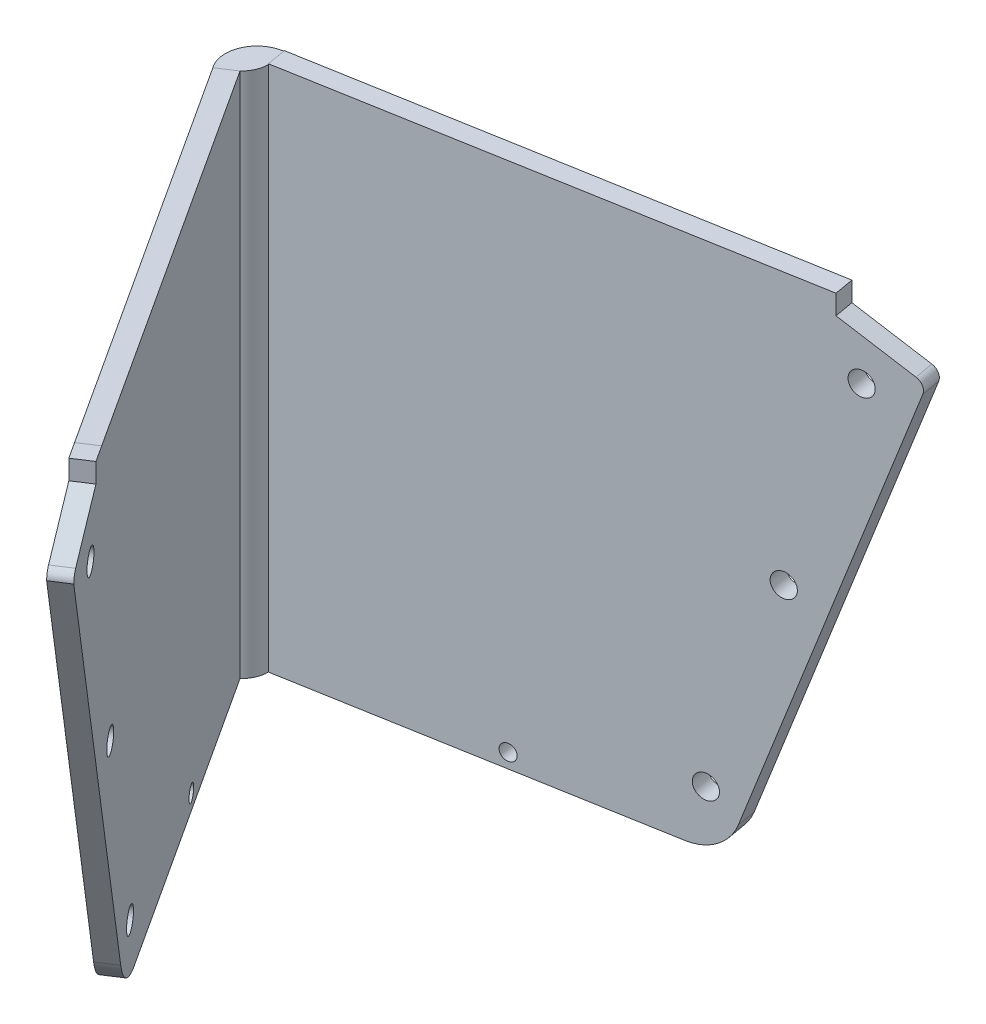
ISO-10303-21;
HEADER;
FILE_DESCRIPTION(('STEP AP214'),'2;1');
FILE_NAME('part.step','',(''),(''),'','','');
FILE_SCHEMA(('AUTOMOTIVE_DESIGN { 1 0 10303 214 1 1 1 1 }'));
ENDSEC;
DATA;
#1=APPLICATION_CONTEXT('core data for automotive mechanical design processes');
#2=APPLICATION_PROTOCOL_DEFINITION('international standard','automotive_design',2000,#1);
#3=PRODUCT_CONTEXT('',#1,'mechanical');
#4=PRODUCT('Part','Part','',(#3));
#5=PRODUCT_RELATED_PRODUCT_CATEGORY('part','',(#4));
#6=PRODUCT_DEFINITION_FORMATION('','',#4);
#7=PRODUCT_DEFINITION_CONTEXT('part definition',#1,'design');
#8=PRODUCT_DEFINITION('design','',#6,#7);
#9=PRODUCT_DEFINITION_SHAPE('','',#8);
#10=(LENGTH_UNIT() NAMED_UNIT(*) SI_UNIT(.MILLI.,.METRE.));
#11=(NAMED_UNIT(*) PLANE_ANGLE_UNIT() SI_UNIT($,.RADIAN.));
#12=(NAMED_UNIT(*) SI_UNIT($,.STERADIAN.) SOLID_ANGLE_UNIT());
#13=UNCERTAINTY_MEASURE_WITH_UNIT(LENGTH_MEASURE(1.E-05),#10,'distance_accuracy_value','');
#14=(GEOMETRIC_REPRESENTATION_CONTEXT(3) GLOBAL_UNCERTAINTY_ASSIGNED_CONTEXT((#13)) GLOBAL_UNIT_ASSIGNED_CONTEXT((#10,
#11,#12)) REPRESENTATION_CONTEXT('',''));
#15=CARTESIAN_POINT('',(0.,0.,0.));
#16=DIRECTION('',(0.,0.,1.));
#17=DIRECTION('',(1.,0.,0.));
#18=AXIS2_PLACEMENT_3D('',#15,#16,#17);
#19=CARTESIAN_POINT('',(-87.7890705863811,13.2918197172623,33.7086379474731));
#20=DIRECTION('',(0.,1.,0.));
#21=DIRECTION('',(0.,0.,1.));
#22=AXIS2_PLACEMENT_3D('',#19,#20,#21);
#23=PLANE('',#22);
#24=DIRECTION('',(0.544639035015025,0.,0.838670567945425));
#25=VECTOR('',#24,1.);
#26=CARTESIAN_POINT('',(-88.4261592946522,13.2918197172623,34.1223681921648));
#27=LINE('',#26,#25);
#28=CARTESIAN_POINT('',(-87.6837386520631,13.2918197172623,35.2655957281004));
#29=VERTEX_POINT('',#28);
#30=CARTESIAN_POINT('',(-87.6599356576769,13.2918197172623,35.3022491251896));
#31=VERTEX_POINT('',#30);
#32=EDGE_CURVE('E68',#29,#31,#27,.T.);
#33=ORIENTED_EDGE('',*,*,#32,.F.);
#34=DIRECTION('',(0.838670567945425,0.,-0.544639035015025));
#35=VECTOR('',#34,1.);
#36=CARTESIAN_POINT('',(-87.683738652063,13.2918197172623,35.2655957281005));
#37=LINE('',#36,#35);
#38=CARTESIAN_POINT('',(-86.8450680841176,13.2918197172623,34.7209566930854));
#39=VERTEX_POINT('',#38);
#40=EDGE_CURVE('E188',#29,#39,#37,.T.);
#41=ORIENTED_EDGE('',*,*,#40,.T.);
#42=CARTESIAN_POINT('',(-87.7890705863811,13.2918197172623,33.7086379474731));
#43=DIRECTION('',(0.,-1.,0.));
#44=DIRECTION('',(0.,0.,1.));
#45=AXIS2_PLACEMENT_3D('',#42,#43,#44);
#46=CIRCLE('',#45,1.38417122026059);
#47=CARTESIAN_POINT('',(-86.4048993661205,13.2918197172623,33.7086379474731));
#48=VERTEX_POINT('',#47);
#49=EDGE_CURVE('E236',#48,#39,#46,.T.);
#50=ORIENTED_EDGE('',*,*,#49,.F.);
#51=DIRECTION('',(0.,0.,1.));
#52=VECTOR('',#51,1.);
#53=CARTESIAN_POINT('',(-86.4048993661205,13.2918197172623,33.7086379474731));
#54=LINE('',#53,#52);
#55=CARTESIAN_POINT('',(-86.4048993661205,13.2918197172623,32.7086379474731));
#56=VERTEX_POINT('',#55);
#57=EDGE_CURVE('E242',#56,#48,#54,.T.);
#58=ORIENTED_EDGE('',*,*,#57,.F.);
#59=CARTESIAN_POINT('',(-86.3764557247758,13.2918197172623,34.3228603703528));
#60=DIRECTION('',(0.,-1.,0.));
#61=DIRECTION('',(0.,0.,1.));
#62=AXIS2_PLACEMENT_3D('',#59,#60,#61);
#63=CIRCLE('',#62,1.61447300109373);
#64=EDGE_CURVE('E239',#31,#56,#63,.T.);
#65=ORIENTED_EDGE('',*,*,#64,.F.);
#66=EDGE_LOOP('',(#33,#41,#50,#58,#65));
#67=FACE_BOUND('',#66,.T.);
#68=ADVANCED_FACE('F51',(#67),#23,.T.);
#69=CARTESIAN_POINT('',(-87.7890705863811,13.2918197172623,33.7086379474731));
#70=DIRECTION('',(0.,-1.,0.));
#71=DIRECTION('',(0.,0.,-1.));
#72=AXIS2_PLACEMENT_3D('',#69,#70,#71);
#73=CYLINDRICAL_SURFACE('',#72,1.38417122026059);
#74=CARTESIAN_POINT('',(-87.7890705863811,-13.5581802827377,33.7086379474731));
#75=DIRECTION('',(0.,-1.,0.));
#76=DIRECTION('',(0.,0.,1.));
#77=AXIS2_PLACEMENT_3D('',#74,#75,#76);
#78=CIRCLE('',#77,1.38417122026059);
#79=CARTESIAN_POINT('',(-86.4048993661205,-13.5581802827377,33.7086379474731));
#80=VERTEX_POINT('',#79);
#81=CARTESIAN_POINT('',(-86.8450680841176,-13.5581802827377,34.7209566930854));
#82=VERTEX_POINT('',#81);
#83=EDGE_CURVE('E235',#80,#82,#78,.T.);
#84=ORIENTED_EDGE('',*,*,#83,.F.);
#85=DIRECTION('',(0.,-1.,0.));
#86=VECTOR('',#85,1.);
#87=CARTESIAN_POINT('',(-86.4048993661205,13.2918197172623,33.7086379474731));
#88=LINE('',#87,#86);
#89=EDGE_CURVE('E12',#48,#80,#88,.T.);
#90=ORIENTED_EDGE('',*,*,#89,.F.);
#91=ORIENTED_EDGE('',*,*,#49,.T.);
#92=DIRECTION('',(0.,-1.,0.));
#93=VECTOR('',#92,1.);
#94=CARTESIAN_POINT('',(-86.8450680841176,13.2918197172623,34.7209566930854));
#95=LINE('',#94,#93);
#96=EDGE_CURVE('E55',#39,#82,#95,.T.);
#97=ORIENTED_EDGE('',*,*,#96,.T.);
#98=EDGE_LOOP('',(#84,#90,#91,#97));
#99=FACE_BOUND('',#98,.T.);
#100=ADVANCED_FACE('F53',(#99),#73,.T.);
#101=CARTESIAN_POINT('',(-86.4048993661205,13.2918197172623,33.7086379474731));
#102=DIRECTION('',(1.,0.,0.));
#103=DIRECTION('',(0.,0.,-1.));
#104=AXIS2_PLACEMENT_3D('',#101,#102,#103);
#105=PLANE('',#104);
#106=DIRECTION('',(0.,0.,1.));
#107=VECTOR('',#106,1.);
#108=CARTESIAN_POINT('',(-86.4048993661205,-13.5581802827377,33.7086379474731));
#109=LINE('',#108,#107);
#110=CARTESIAN_POINT('',(-86.4048993661205,-13.5581802827377,32.7086379474731));
#111=VERTEX_POINT('',#110);
#112=EDGE_CURVE('E240',#111,#80,#109,.T.);
#113=ORIENTED_EDGE('',*,*,#112,.F.);
#114=DIRECTION('',(0.,-1.,0.));
#115=VECTOR('',#114,1.);
#116=CARTESIAN_POINT('',(-86.4048993661205,13.2918197172623,32.7086379474731));
#117=LINE('',#116,#115);
#118=EDGE_CURVE('E60',#56,#111,#117,.T.);
#119=ORIENTED_EDGE('',*,*,#118,.F.);
#120=ORIENTED_EDGE('',*,*,#57,.T.);
#121=ORIENTED_EDGE('',*,*,#89,.T.);
#122=EDGE_LOOP('',(#113,#119,#120,#121));
#123=FACE_BOUND('',#122,.T.);
#124=ADVANCED_FACE('F288',(#123),#105,.T.);
#125=CARTESIAN_POINT('',(-86.3764557247758,13.2918197172623,34.3228603703528));
#126=DIRECTION('',(0.,-1.,0.));
#127=DIRECTION('',(0.,0.,-1.));
#128=AXIS2_PLACEMENT_3D('',#125,#126,#127);
#129=CYLINDRICAL_SURFACE('',#128,1.61447300109373);
#130=DIRECTION('',(0.,-1.,0.));
#131=VECTOR('',#130,1.);
#132=CARTESIAN_POINT('',(-87.6599356576769,13.2918197172623,35.3022491251896));
#133=LINE('',#132,#131);
#134=CARTESIAN_POINT('',(-87.6599356576769,-13.5581802827377,35.3022491251896));
#135=VERTEX_POINT('',#134);
#136=EDGE_CURVE('E145',#31,#135,#133,.T.);
#137=ORIENTED_EDGE('',*,*,#136,.F.);
#138=ORIENTED_EDGE('',*,*,#64,.T.);
#139=ORIENTED_EDGE('',*,*,#118,.T.);
#140=CARTESIAN_POINT('',(-86.3764557247758,-13.5581802827377,34.3228603703528));
#141=DIRECTION('',(0.,-1.,0.));
#142=DIRECTION('',(0.,0.,1.));
#143=AXIS2_PLACEMENT_3D('',#140,#141,#142);
#144=CIRCLE('',#143,1.61447300109373);
#145=EDGE_CURVE('E76',#135,#111,#144,.T.);
#146=ORIENTED_EDGE('',*,*,#145,.F.);
#147=EDGE_LOOP('',(#137,#138,#139,#146));
#148=FACE_BOUND('',#147,.T.);
#149=ADVANCED_FACE('F290',(#148),#129,.T.);
#150=CARTESIAN_POINT('',(-87.7890705863811,-13.5581802827377,33.7086379474731));
#151=DIRECTION('',(0.,1.,0.));
#152=DIRECTION('',(0.,0.,1.));
#153=AXIS2_PLACEMENT_3D('',#150,#151,#152);
#154=PLANE('',#153);
#155=DIRECTION('',(0.544639035015025,0.,0.838670567945425));
#156=VECTOR('',#155,1.);
#157=CARTESIAN_POINT('',(-77.7823264761029,-13.5581802827378,50.5124334301487));
#158=LINE('',#157,#156);
#159=CARTESIAN_POINT('',(-77.6892577633896,-13.5581802827377,50.6557466800833));
#160=VERTEX_POINT('',#159);
#161=EDGE_CURVE('E138',#135,#160,#158,.T.);
#162=ORIENTED_EDGE('',*,*,#161,.F.);
#163=ORIENTED_EDGE('',*,*,#145,.T.);
#164=ORIENTED_EDGE('',*,*,#112,.T.);
#165=ORIENTED_EDGE('',*,*,#83,.T.);
#166=DIRECTION('',(0.544639035015025,0.,0.838670567945425));
#167=VECTOR('',#166,1.);
#168=CARTESIAN_POINT('',(-76.9436559081574,-13.5581802827378,49.9677943951337));
#169=LINE('',#168,#167);
#170=CARTESIAN_POINT('',(-76.8505871954441,-13.5581802827377,50.1111076450683));
#171=VERTEX_POINT('',#170);
#172=EDGE_CURVE('E154',#82,#171,#169,.T.);
#173=ORIENTED_EDGE('',*,*,#172,.T.);
#174=DIRECTION('',(0.838670567945425,0.,-0.544639035015025));
#175=VECTOR('',#174,1.);
#176=CARTESIAN_POINT('',(-77.6892577633896,-13.5581802827377,50.6557466800833));
#177=LINE('',#176,#175);
#178=EDGE_CURVE('E150',#160,#171,#177,.T.);
#179=ORIENTED_EDGE('',*,*,#178,.F.);
#180=EDGE_LOOP('',(#162,#163,#164,#165,#173,#179));
#181=FACE_BOUND('',#180,.T.);
#182=ADVANCED_FACE('F151',(#181),#154,.F.);
#183=CARTESIAN_POINT('',(-77.6892577633896,-11.0581802827377,50.6557466800833));
#184=DIRECTION('',(0.838670567945425,0.,-0.544639035015025));
#185=DIRECTION('',(-0.544639035015025,0.,-0.838670567945425));
#186=AXIS2_PLACEMENT_3D('',#183,#184,#185);
#187=CYLINDRICAL_SURFACE('',#186,2.5);
#188=CARTESIAN_POINT('',(-76.8505871954441,-11.0581802827377,50.1111076450683));
#189=DIRECTION('',(-0.838670567945425,0.,0.544639035015025));
#190=DIRECTION('',(0.544639035015025,0.,0.838670567945425));
#191=AXIS2_PLACEMENT_3D('',#188,#189,#190);
#192=CIRCLE('',#191,2.5);
#193=CARTESIAN_POINT('',(-75.5711039899552,-11.9132306410519,52.0813390049899));
#194=VERTEX_POINT('',#193);
#195=EDGE_CURVE('E190',#171,#194,#192,.T.);
#196=ORIENTED_EDGE('',*,*,#195,.T.);
#197=DIRECTION('',(0.838670567945425,0.,-0.544639035015025));
#198=VECTOR('',#197,1.);
#199=CARTESIAN_POINT('',(-76.4097745579006,-11.9132306410519,52.6259780400049));
#200=LINE('',#199,#198);
#201=CARTESIAN_POINT('',(-76.4097745579006,-11.9132306410519,52.6259780400049));
#202=VERTEX_POINT('',#201);
#203=EDGE_CURVE('E157',#202,#194,#200,.T.);
#204=ORIENTED_EDGE('',*,*,#203,.F.);
#205=CARTESIAN_POINT('',(-77.6892577633896,-11.0581802827377,50.6557466800833));
#206=DIRECTION('',(-0.838670567945425,0.,0.544639035015025));
#207=DIRECTION('',(0.544639035015025,0.,0.838670567945425));
#208=AXIS2_PLACEMENT_3D('',#205,#206,#207);
#209=CIRCLE('',#208,2.5);
#210=EDGE_CURVE('E143',#160,#202,#209,.T.);
#211=ORIENTED_EDGE('',*,*,#210,.F.);
#212=ORIENTED_EDGE('',*,*,#178,.T.);
#213=EDGE_LOOP('',(#196,#204,#211,#212));
#214=FACE_BOUND('',#213,.T.);
#215=ADVANCED_FACE('F159',(#214),#187,.T.);
#216=CARTESIAN_POINT('',(-74.490159444689,-2.19145722415175,55.5819260968484));
#217=DIRECTION('',(-0.512027693066062,0.340835314924312,-0.788453505055239));
#218=DIRECTION('',(-0.838670567945425,0.,0.544639035015025));
#219=AXIS2_PLACEMENT_3D('',#216,#217,#218);
#220=PLANE('',#219);
#221=DIRECTION('',(0.18563221701942,0.940123017535708,0.285848547143431));
#222=VECTOR('',#221,1.);
#223=CARTESIAN_POINT('',(-73.6514888767436,-2.19145722415175,55.0372870618334));
#224=LINE('',#223,#222);
#225=CARTESIAN_POINT('',(-71.1306866434094,10.5749916189658,58.9189821016503));
#226=VERTEX_POINT('',#225);
#227=EDGE_CURVE('E192',#194,#226,#224,.T.);
#228=ORIENTED_EDGE('',*,*,#227,.T.);
#229=DIRECTION('',(0.838670567945425,0.,-0.544639035015025));
#230=VECTOR('',#229,1.);
#231=CARTESIAN_POINT('',(-71.9693572113548,10.5749916189658,59.4636211366653));
#232=LINE('',#231,#230);
#233=CARTESIAN_POINT('',(-71.9693572113548,10.5749916189658,59.4636211366653));
#234=VERTEX_POINT('',#233);
#235=EDGE_CURVE('E229',#234,#226,#232,.T.);
#236=ORIENTED_EDGE('',*,*,#235,.F.);
#237=DIRECTION('',(0.18563221701942,0.940123017535708,0.285848547143431));
#238=VECTOR('',#237,1.);
#239=CARTESIAN_POINT('',(-74.490159444689,-2.19145722415175,55.5819260968484));
#240=LINE('',#239,#238);
#241=EDGE_CURVE('E162',#202,#234,#240,.T.);
#242=ORIENTED_EDGE('',*,*,#241,.F.);
#243=ORIENTED_EDGE('',*,*,#203,.T.);
#244=EDGE_LOOP('',(#228,#236,#242,#243));
#245=FACE_BOUND('',#244,.T.);
#246=ADVANCED_FACE('F261',(#245),#220,.F.);
#247=CARTESIAN_POINT('',(-72.2416767288623,10.5749916189658,59.0442858526926));
#248=DIRECTION('',(0.838670567945425,0.,-0.544639035015025));
#249=DIRECTION('',(-0.544639035015025,0.,-0.838670567945425));
#250=AXIS2_PLACEMENT_3D('',#247,#248,#249);
#251=CYLINDRICAL_SURFACE('',#250,0.5);
#252=CARTESIAN_POINT('',(-71.4030061609169,10.5749916189658,58.4996468176776));
#253=DIRECTION('',(-0.838670567945425,0.,0.544639035015025));
#254=DIRECTION('',(0.544639035015025,0.,0.838670567945425));
#255=AXIS2_PLACEMENT_3D('',#252,#253,#254);
#256=CIRCLE('',#255,0.5);
#257=CARTESIAN_POINT('',(-71.3098674005086,11.0448379293587,58.6430679316034));
#258=VERTEX_POINT('',#257);
#259=EDGE_CURVE('E194',#226,#258,#256,.T.);
#260=ORIENTED_EDGE('',*,*,#259,.T.);
#261=DIRECTION('',(0.838670567945425,0.,-0.544639035015025));
#262=VECTOR('',#261,1.);
#263=CARTESIAN_POINT('',(-72.148537968454,11.0448379293587,59.1877069666185));
#264=LINE('',#263,#262);
#265=CARTESIAN_POINT('',(-72.148537968454,11.0448379293587,59.1877069666185));
#266=VERTEX_POINT('',#265);
#267=EDGE_CURVE('E226',#266,#258,#264,.T.);
#268=ORIENTED_EDGE('',*,*,#267,.F.);
#269=CARTESIAN_POINT('',(-72.2416767288623,10.5749916189658,59.0442858526926));
#270=DIRECTION('',(-0.838670567945425,0.,0.544639035015025));
#271=DIRECTION('',(0.544639035015025,0.,0.838670567945425));
#272=AXIS2_PLACEMENT_3D('',#269,#270,#271);
#273=CIRCLE('',#272,0.5);
#274=EDGE_CURVE('E164',#234,#266,#273,.T.);
#275=ORIENTED_EDGE('',*,*,#274,.F.);
#276=ORIENTED_EDGE('',*,*,#235,.T.);
#277=EDGE_LOOP('',(#260,#268,#275,#276));
#278=FACE_BOUND('',#277,.T.);
#279=ADVANCED_FACE('F268',(#278),#251,.T.);
#280=CARTESIAN_POINT('',(-75.1899700901509,13.0773598212357,54.5043122025972));
#281=DIRECTION('',(-0.186277520816592,-0.939692620785909,-0.286842227851713));
#282=DIRECTION('',(0.,0.291952218467168,-0.956432905191001));
#283=AXIS2_PLACEMENT_3D('',#280,#281,#282);
#284=PLANE('',#283);
#285=DIRECTION('',(-0.511793282195578,0.342020143325667,-0.788092543968643));
#286=VECTOR('',#285,1.);
#287=CARTESIAN_POINT('',(-74.3512995222055,13.0773598212357,53.9596731675822));
#288=LINE('',#287,#286);
#289=CARTESIAN_POINT('',(-73.229092208742,12.32741346683,55.687720891721));
#290=VERTEX_POINT('',#289);
#291=EDGE_CURVE('E196',#258,#290,#288,.T.);
#292=ORIENTED_EDGE('',*,*,#291,.T.);
#293=DIRECTION('',(0.838670567945425,0.,-0.544639035015025));
#294=VECTOR('',#293,1.);
#295=CARTESIAN_POINT('',(-74.0677627766874,12.32741346683,56.2323599267361));
#296=LINE('',#295,#294);
#297=CARTESIAN_POINT('',(-74.0677627766874,12.32741346683,56.2323599267361));
#298=VERTEX_POINT('',#297);
#299=EDGE_CURVE('E223',#298,#290,#296,.T.);
#300=ORIENTED_EDGE('',*,*,#299,.F.);
#301=DIRECTION('',(-0.511793282195578,0.342020143325667,-0.788092543968643));
#302=VECTOR('',#301,1.);
#303=CARTESIAN_POINT('',(-75.1899700901509,13.0773598212357,54.5043122025972));
#304=LINE('',#303,#302);
#305=EDGE_CURVE('E168',#266,#298,#304,.T.);
#306=ORIENTED_EDGE('',*,*,#305,.F.);
#307=ORIENTED_EDGE('',*,*,#267,.T.);
#308=EDGE_LOOP('',(#292,#300,#306,#307));
#309=FACE_BOUND('',#308,.T.);
#310=ADVANCED_FACE('F271',(#309),#284,.F.);
#311=CARTESIAN_POINT('',(-74.0677627766874,0.,56.2323599267361));
#312=DIRECTION('',(-0.544639035015025,0.,-0.838670567945425));
#313=DIRECTION('',(-0.838670567945425,0.,0.544639035015025));
#314=AXIS2_PLACEMENT_3D('',#311,#312,#313);
#315=PLANE('',#314);
#316=DIRECTION('',(0.,1.,0.));
#317=VECTOR('',#316,1.);
#318=CARTESIAN_POINT('',(-73.229092208742,0.,55.687720891721));
#319=LINE('',#318,#317);
#320=CARTESIAN_POINT('',(-73.229092208742,13.32741346683,55.687720891721));
#321=VERTEX_POINT('',#320);
#322=EDGE_CURVE('E198',#290,#321,#319,.T.);
#323=ORIENTED_EDGE('',*,*,#322,.T.);
#324=DIRECTION('',(0.838670567945425,0.,-0.544639035015025));
#325=VECTOR('',#324,1.);
#326=CARTESIAN_POINT('',(-74.0677627766874,13.32741346683,56.2323599267361));
#327=LINE('',#326,#325);
#328=CARTESIAN_POINT('',(-74.0677627766874,13.32741346683,56.2323599267361));
#329=VERTEX_POINT('',#328);
#330=EDGE_CURVE('E220',#329,#321,#327,.T.);
#331=ORIENTED_EDGE('',*,*,#330,.F.);
#332=DIRECTION('',(0.,1.,0.));
#333=VECTOR('',#332,1.);
#334=CARTESIAN_POINT('',(-74.0677627766874,0.,56.2323599267361));
#335=LINE('',#334,#333);
#336=EDGE_CURVE('E170',#298,#329,#335,.T.);
#337=ORIENTED_EDGE('',*,*,#336,.F.);
#338=ORIENTED_EDGE('',*,*,#299,.T.);
#339=EDGE_LOOP('',(#323,#331,#337,#338));
#340=FACE_BOUND('',#339,.T.);
#341=ADVANCED_FACE('F276',(#340),#315,.F.);
#342=CARTESIAN_POINT('',(-77.7823264761029,13.32741346683,50.5124334301487));
#343=DIRECTION('',(0.,-1.,0.));
#344=DIRECTION('',(0.,0.,-1.));
#345=AXIS2_PLACEMENT_3D('',#342,#343,#344);
#346=PLANE('',#345);
#347=DIRECTION('',(-0.544639035015025,0.,-0.838670567945425));
#348=VECTOR('',#347,1.);
#349=CARTESIAN_POINT('',(-76.9436559081574,13.32741346683,49.9677943951337));
#350=LINE('',#349,#348);
#351=CARTESIAN_POINT('',(-73.773731243757,13.32741346683,54.8490503237756));
#352=VERTEX_POINT('',#351);
#353=EDGE_CURVE('E200',#321,#352,#350,.T.);
#354=ORIENTED_EDGE('',*,*,#353,.T.);
#355=DIRECTION('',(0.838670567945425,0.,-0.544639035015025));
#356=VECTOR('',#355,1.);
#357=CARTESIAN_POINT('',(-74.6124018117025,13.32741346683,55.3936893587906));
#358=LINE('',#357,#356);
#359=CARTESIAN_POINT('',(-74.6124018117025,13.32741346683,55.3936893587906));
#360=VERTEX_POINT('',#359);
#361=EDGE_CURVE('E217',#360,#352,#358,.T.);
#362=ORIENTED_EDGE('',*,*,#361,.F.);
#363=DIRECTION('',(-0.544639035015025,0.,-0.838670567945425));
#364=VECTOR('',#363,1.);
#365=CARTESIAN_POINT('',(-77.7823264761029,13.32741346683,50.5124334301487));
#366=LINE('',#365,#364);
#367=EDGE_CURVE('E172',#329,#360,#366,.T.);
#368=ORIENTED_EDGE('',*,*,#367,.F.);
#369=ORIENTED_EDGE('',*,*,#330,.T.);
#370=EDGE_LOOP('',(#354,#362,#368,#369));
#371=FACE_BOUND('',#370,.T.);
#372=ADVANCED_FACE('F282',(#371),#346,.F.);
#373=CARTESIAN_POINT('',(-73.5507855638559,9.57091084000135,57.0284350238658));
#374=DIRECTION('',(0.838670567945425,0.,-0.544639035015025));
#375=DIRECTION('',(-0.544639035015025,0.,-0.838670567945425));
#376=AXIS2_PLACEMENT_3D('',#373,#374,#375);
#377=CYLINDRICAL_SURFACE('',#376,0.600000000000008);
#378=CARTESIAN_POINT('',(-73.5507855638559,9.57091084000135,57.0284350238658));
#379=DIRECTION('',(-0.838670567945425,0.,0.544639035015025));
#380=DIRECTION('',(0.544639035015025,0.,0.838670567945425));
#381=AXIS2_PLACEMENT_3D('',#378,#379,#380);
#382=CIRCLE('',#381,0.600000000000008);
#383=CARTESIAN_POINT('',(-73.2240021428469,9.57091084000135,57.5316373646331));
#384=VERTEX_POINT('',#383);
#385=EDGE_CURVE('E182',#384,#384,#382,.T.);
#386=ORIENTED_EDGE('',*,*,#385,.T.);
#387=EDGE_LOOP('',(#386));
#388=FACE_BOUND('',#387,.T.);
#389=CARTESIAN_POINT('',(-72.7121149959105,9.57091084000135,56.4837959888508));
#390=DIRECTION('',(-0.838670567945425,0.,0.544639035015025));
#391=DIRECTION('',(0.544639035015025,0.,0.838670567945425));
#392=AXIS2_PLACEMENT_3D('',#389,#390,#391);
#393=CIRCLE('',#392,0.600000000000008);
#394=CARTESIAN_POINT('',(-72.3853315749015,9.57091084000135,56.986998329618));
#395=VERTEX_POINT('',#394);
#396=EDGE_CURVE('E211',#395,#395,#393,.T.);
#397=ORIENTED_EDGE('',*,*,#396,.F.);
#398=EDGE_LOOP('',(#397));
#399=FACE_BOUND('',#398,.T.);
#400=ADVANCED_FACE('F321',(#388,#399),#377,.F.);
#401=CARTESIAN_POINT('',(-77.2875578716963,-11.0206657095624,51.2743102692699));
#402=DIRECTION('',(0.838670567945425,0.,-0.544639035015025));
#403=DIRECTION('',(-0.544639035015025,0.,-0.838670567945425));
#404=AXIS2_PLACEMENT_3D('',#401,#402,#403);
#405=CYLINDRICAL_SURFACE('',#404,0.599999999999995);
#406=CARTESIAN_POINT('',(-77.2875578716963,-11.0206657095624,51.2743102692699));
#407=DIRECTION('',(-0.838670567945425,0.,0.544639035015025));
#408=DIRECTION('',(0.544639035015025,0.,0.838670567945425));
#409=AXIS2_PLACEMENT_3D('',#406,#407,#408);
#410=CIRCLE('',#409,0.599999999999995);
#411=CARTESIAN_POINT('',(-76.9607744506873,-11.0206657095624,51.7775126100371));
#412=VERTEX_POINT('',#411);
#413=EDGE_CURVE('E179',#412,#412,#410,.T.);
#414=ORIENTED_EDGE('',*,*,#413,.T.);
#415=EDGE_LOOP('',(#414));
#416=FACE_BOUND('',#415,.T.);
#417=CARTESIAN_POINT('',(-76.4488873037509,-11.0206657095624,50.7296712342548));
#418=DIRECTION('',(-0.838670567945425,0.,0.544639035015025));
#419=DIRECTION('',(0.544639035015025,0.,0.838670567945425));
#420=AXIS2_PLACEMENT_3D('',#417,#418,#419);
#421=CIRCLE('',#420,0.599999999999995);
#422=CARTESIAN_POINT('',(-76.1221038827419,-11.0206657095624,51.2328735750221));
#423=VERTEX_POINT('',#422);
#424=EDGE_CURVE('E208',#423,#423,#421,.T.);
#425=ORIENTED_EDGE('',*,*,#424,.F.);
#426=EDGE_LOOP('',(#425));
#427=FACE_BOUND('',#426,.T.);
#428=ADVANCED_FACE('F328',(#416,#427),#405,.F.);
#429=CARTESIAN_POINT('',(-83.0859573290994,-12.7798807949535,42.3455580986133));
#430=DIRECTION('',(0.838670567945425,0.,-0.544639035015025));
#431=DIRECTION('',(-0.544639035015025,0.,-0.838670567945425));
#432=AXIS2_PLACEMENT_3D('',#429,#430,#431);
#433=CYLINDRICAL_SURFACE('',#432,0.399999999999994);
#434=CARTESIAN_POINT('',(-83.0859573290994,-12.7798807949535,42.3455580986133));
#435=DIRECTION('',(-0.838670567945425,0.,0.544639035015025));
#436=DIRECTION('',(0.544639035015025,0.,0.838670567945425));
#437=AXIS2_PLACEMENT_3D('',#434,#435,#436);
#438=CIRCLE('',#437,0.399999999999994);
#439=CARTESIAN_POINT('',(-82.8681017150934,-12.7798807949535,42.6810263257915));
#440=VERTEX_POINT('',#439);
#441=EDGE_CURVE('E176',#440,#440,#438,.T.);
#442=ORIENTED_EDGE('',*,*,#441,.T.);
#443=EDGE_LOOP('',(#442));
#444=FACE_BOUND('',#443,.T.);
#445=CARTESIAN_POINT('',(-82.247286761154,-12.7798807949535,41.8009190635983));
#446=DIRECTION('',(-0.838670567945425,0.,0.544639035015025));
#447=DIRECTION('',(0.544639035015025,0.,0.838670567945425));
#448=AXIS2_PLACEMENT_3D('',#445,#446,#447);
#449=CIRCLE('',#448,0.399999999999994);
#450=CARTESIAN_POINT('',(-82.029431147148,-12.7798807949535,42.1363872907764));
#451=VERTEX_POINT('',#450);
#452=EDGE_CURVE('E205',#451,#451,#449,.T.);
#453=ORIENTED_EDGE('',*,*,#452,.F.);
#454=EDGE_LOOP('',(#453));
#455=FACE_BOUND('',#454,.T.);
#456=ADVANCED_FACE('F325',(#444,#455),#433,.F.);
#457=CARTESIAN_POINT('',(-77.7930845570303,13.318752346206,50.4958674382508));
#458=DIRECTION('',(0.000807738504068611,-0.999998900249203,0.00124380822233926));
#459=DIRECTION('',(0.,-0.00124380862809551,-0.999999226469749));
#460=AXIS2_PLACEMENT_3D('',#457,#458,#459);
#461=PLANE('',#460);
#462=DIRECTION('',(-0.544638436047812,-0.00148307126764487,-0.838669645616799));
#463=VECTOR('',#462,1.);
#464=CARTESIAN_POINT('',(-76.9544139890848,13.318752346206,49.9512284032357));
#465=LINE('',#464,#463);
#466=EDGE_CURVE('E202',#352,#39,#465,.T.);
#467=ORIENTED_EDGE('',*,*,#466,.T.);
#468=ORIENTED_EDGE('',*,*,#40,.F.);
#469=DIRECTION('',(-0.544638436047812,-0.00148307126764487,-0.838669645616799));
#470=VECTOR('',#469,1.);
#471=CARTESIAN_POINT('',(-77.7930845570303,13.318752346206,50.4958674382508));
#472=LINE('',#471,#470);
#473=EDGE_CURVE('E174',#360,#29,#472,.T.);
#474=ORIENTED_EDGE('',*,*,#473,.F.);
#475=ORIENTED_EDGE('',*,*,#361,.T.);
#476=EDGE_LOOP('',(#467,#468,#474,#475));
#477=FACE_BOUND('',#476,.T.);
#478=ADVANCED_FACE('F285',(#477),#461,.F.);
#479=CARTESIAN_POINT('',(-75.4191717177761,-0.724877434780505,54.1513726465678));
#480=DIRECTION('',(0.838670567945425,0.,-0.544639035015025));
#481=DIRECTION('',(-0.544639035015025,0.,-0.838670567945425));
#482=AXIS2_PLACEMENT_3D('',#479,#480,#481);
#483=CYLINDRICAL_SURFACE('',#482,0.600000000000008);
#484=CARTESIAN_POINT('',(-75.4191717177761,-0.724877434780505,54.1513726465678));
#485=DIRECTION('',(-0.838670567945425,0.,0.544639035015025));
#486=DIRECTION('',(0.544639035015025,0.,0.838670567945425));
#487=AXIS2_PLACEMENT_3D('',#484,#485,#486);
#488=CIRCLE('',#487,0.600000000000008);
#489=CARTESIAN_POINT('',(-75.0923882967671,-0.724877434780505,54.6545749873351));
#490=VERTEX_POINT('',#489);
#491=EDGE_CURVE('E185',#490,#490,#488,.T.);
#492=ORIENTED_EDGE('',*,*,#491,.T.);
#493=EDGE_LOOP('',(#492));
#494=FACE_BOUND('',#493,.T.);
#495=CARTESIAN_POINT('',(-74.5805011498307,-0.724877434780505,53.6067336115528));
#496=DIRECTION('',(-0.838670567945425,0.,0.544639035015025));
#497=DIRECTION('',(0.544639035015025,0.,0.838670567945425));
#498=AXIS2_PLACEMENT_3D('',#495,#496,#497);
#499=CIRCLE('',#498,0.600000000000008);
#500=CARTESIAN_POINT('',(-74.2537177288217,-0.724877434780505,54.1099359523201));
#501=VERTEX_POINT('',#500);
#502=EDGE_CURVE('E147',#501,#501,#499,.T.);
#503=ORIENTED_EDGE('',*,*,#502,.F.);
#504=EDGE_LOOP('',(#503));
#505=FACE_BOUND('',#504,.T.);
#506=ADVANCED_FACE('F324',(#494,#505),#483,.F.);
#507=CARTESIAN_POINT('',(-77.7823264761029,0.,50.5124334301487));
#508=DIRECTION('',(-0.838670567945425,0.,0.544639035015025));
#509=DIRECTION('',(0.544639035015025,0.,0.838670567945425));
#510=AXIS2_PLACEMENT_3D('',#507,#508,#509);
#511=PLANE('',#510);
#512=ORIENTED_EDGE('',*,*,#32,.T.);
#513=ORIENTED_EDGE('',*,*,#136,.T.);
#514=ORIENTED_EDGE('',*,*,#161,.T.);
#515=ORIENTED_EDGE('',*,*,#210,.T.);
#516=ORIENTED_EDGE('',*,*,#241,.T.);
#517=ORIENTED_EDGE('',*,*,#274,.T.);
#518=ORIENTED_EDGE('',*,*,#305,.T.);
#519=ORIENTED_EDGE('',*,*,#336,.T.);
#520=ORIENTED_EDGE('',*,*,#367,.T.);
#521=ORIENTED_EDGE('',*,*,#473,.T.);
#522=EDGE_LOOP('',(#512,#513,#514,#515,#516,#517,#518,#519,#520,#521));
#523=FACE_BOUND('',#522,.T.);
#524=ORIENTED_EDGE('',*,*,#441,.F.);
#525=EDGE_LOOP('',(#524));
#526=FACE_BOUND('',#525,.T.);
#527=ORIENTED_EDGE('',*,*,#413,.F.);
#528=EDGE_LOOP('',(#527));
#529=FACE_BOUND('',#528,.T.);
#530=ORIENTED_EDGE('',*,*,#385,.F.);
#531=EDGE_LOOP('',(#530));
#532=FACE_BOUND('',#531,.T.);
#533=ORIENTED_EDGE('',*,*,#491,.F.);
#534=EDGE_LOOP('',(#533));
#535=FACE_BOUND('',#534,.T.);
#536=ADVANCED_FACE('F140',(#523,#526,#529,#532,#535),#511,.T.);
#537=CARTESIAN_POINT('',(-76.9436559081574,0.,49.9677943951337));
#538=DIRECTION('',(-0.838670567945425,0.,0.544639035015025));
#539=DIRECTION('',(0.544639035015025,0.,0.838670567945425));
#540=AXIS2_PLACEMENT_3D('',#537,#538,#539);
#541=PLANE('',#540);
#542=ORIENTED_EDGE('',*,*,#96,.F.);
#543=ORIENTED_EDGE('',*,*,#466,.F.);
#544=ORIENTED_EDGE('',*,*,#353,.F.);
#545=ORIENTED_EDGE('',*,*,#322,.F.);
#546=ORIENTED_EDGE('',*,*,#291,.F.);
#547=ORIENTED_EDGE('',*,*,#259,.F.);
#548=ORIENTED_EDGE('',*,*,#227,.F.);
#549=ORIENTED_EDGE('',*,*,#195,.F.);
#550=ORIENTED_EDGE('',*,*,#172,.F.);
#551=EDGE_LOOP('',(#542,#543,#544,#545,#546,#547,#548,#549,#550));
#552=FACE_BOUND('',#551,.T.);
#553=ORIENTED_EDGE('',*,*,#452,.T.);
#554=EDGE_LOOP('',(#553));
#555=FACE_BOUND('',#554,.T.);
#556=ORIENTED_EDGE('',*,*,#424,.T.);
#557=EDGE_LOOP('',(#556));
#558=FACE_BOUND('',#557,.T.);
#559=ORIENTED_EDGE('',*,*,#396,.T.);
#560=EDGE_LOOP('',(#559));
#561=FACE_BOUND('',#560,.T.);
#562=ORIENTED_EDGE('',*,*,#502,.T.);
#563=EDGE_LOOP('',(#562));
#564=FACE_BOUND('',#563,.T.);
#565=ADVANCED_FACE('F256',(#552,#555,#558,#561,#564),#541,.F.);
#566=CLOSED_SHELL('',(#68,#100,#124,#149,#182,#215,#246,#279,#310,#341,#372,#400,#428,#456,#478,
#506,#536,#565));
#567=MANIFOLD_SOLID_BREP('B2',#566);
#568=CARTESIAN_POINT('',(2.98544189737295,13.32741346683,16.9312823560962));
#569=DIRECTION('',(0.,1.,0.));
#570=DIRECTION('',(0.,0.,1.));
#571=AXIS2_PLACEMENT_3D('',#568,#569,#570);
#572=PLANE('',#571);
#573=DIRECTION('',(-0.984807753012208,0.,0.173648177666931));
#574=VECTOR('',#573,1.);
#575=CARTESIAN_POINT('',(3.15909007503988,13.32741346683,17.9160901091084));
#576=LINE('',#575,#574);
#577=CARTESIAN_POINT('',(-61.7847055408153,13.32741346683,29.3674335057998));
#578=VERTEX_POINT('',#577);
#579=CARTESIAN_POINT('',(-86.4048993661204,13.32741346683,33.7086379474731));
#580=VERTEX_POINT('',#579);
#581=EDGE_CURVE('E594',#578,#580,#576,.T.);
#582=ORIENTED_EDGE('',*,*,#581,.F.);
#583=DIRECTION('',(0.173648177666931,0.,0.984807753012208));
#584=VECTOR('',#583,1.);
#585=CARTESIAN_POINT('',(-61.9583537184822,13.32741346683,28.3826257527876));
#586=LINE('',#585,#584);
#587=CARTESIAN_POINT('',(-61.9583537184822,13.32741346683,28.3826257527876));
#588=VERTEX_POINT('',#587);
#589=EDGE_CURVE('E49',#588,#578,#586,.T.);
#590=ORIENTED_EDGE('',*,*,#589,.F.);
#591=DIRECTION('',(-0.984807753012208,0.,0.173648177666931));
#592=VECTOR('',#591,1.);
#593=CARTESIAN_POINT('',(2.98544189737295,13.32741346683,16.9312823560962));
#594=LINE('',#593,#592);
#595=CARTESIAN_POINT('',(-86.5785475437873,13.32741346683,32.7238301944609));
#596=VERTEX_POINT('',#595);
#597=EDGE_CURVE('E621',#588,#596,#594,.T.);
#598=ORIENTED_EDGE('',*,*,#597,.T.);
#599=DIRECTION('',(0.173648177666931,0.,0.984807753012208));
#600=VECTOR('',#599,1.);
#601=CARTESIAN_POINT('',(-86.5785475437873,13.32741346683,32.7238301944609));
#602=LINE('',#601,#600);
#603=EDGE_CURVE('E539',#596,#580,#602,.T.);
#604=ORIENTED_EDGE('',*,*,#603,.T.);
#605=EDGE_LOOP('',(#582,#590,#598,#604));
#606=FACE_BOUND('',#605,.T.);
#607=ADVANCED_FACE('F488',(#606),#572,.T.);
#608=CARTESIAN_POINT('',(-61.9583537184822,0.,28.3826257527876));
#609=DIRECTION('',(-0.984807753012208,0.,0.173648177666931));
#610=DIRECTION('',(0.173648177666931,0.,0.984807753012208));
#611=AXIS2_PLACEMENT_3D('',#608,#609,#610);
#612=PLANE('',#611);
#613=DIRECTION('',(0.,-1.,0.));
#614=VECTOR('',#613,1.);
#615=CARTESIAN_POINT('',(-61.7847055408153,0.,29.3674335057998));
#616=LINE('',#615,#614);
#617=CARTESIAN_POINT('',(-61.7847055408153,12.32741346683,29.3674335057998));
#618=VERTEX_POINT('',#617);
#619=EDGE_CURVE('E597',#578,#618,#616,.T.);
#620=ORIENTED_EDGE('',*,*,#619,.T.);
#621=DIRECTION('',(0.173648177666931,0.,0.984807753012208));
#622=VECTOR('',#621,1.);
#623=CARTESIAN_POINT('',(-61.9583537184822,12.32741346683,28.3826257527876));
#624=LINE('',#623,#622);
#625=CARTESIAN_POINT('',(-61.9583537184822,12.32741346683,28.3826257527876));
#626=VERTEX_POINT('',#625);
#627=EDGE_CURVE('E496',#626,#618,#624,.T.);
#628=ORIENTED_EDGE('',*,*,#627,.F.);
#629=DIRECTION('',(0.,-1.,0.));
#630=VECTOR('',#629,1.);
#631=CARTESIAN_POINT('',(-61.9583537184822,0.,28.3826257527876));
#632=LINE('',#631,#630);
#633=EDGE_CURVE('E655',#588,#626,#632,.T.);
#634=ORIENTED_EDGE('',*,*,#633,.F.);
#635=ORIENTED_EDGE('',*,*,#589,.T.);
#636=EDGE_LOOP('',(#620,#628,#634,#635));
#637=FACE_BOUND('',#636,.T.);
#638=ADVANCED_FACE('F657',(#637),#612,.F.);
#639=CARTESIAN_POINT('',(-0.709775707836792,-10.3091460228981,17.5828489194836));
#640=DIRECTION('',(-0.336824088833464,-0.939692620785909,0.0593911746138846));
#641=DIRECTION('',(0.941354312409702,-0.337419706756523,0.));
#642=AXIS2_PLACEMENT_3D('',#639,#640,#641);
#643=PLANE('',#642);
#644=DIRECTION('',(0.925416578398324,-0.342020143325667,-0.163175911166535));
#645=VECTOR('',#644,1.);
#646=CARTESIAN_POINT('',(-0.536127530169861,-10.3091460228981,18.5676566724958));
#647=LINE('',#646,#645);
#648=CARTESIAN_POINT('',(-58.3143933718216,11.0448379293587,28.7555238389253));
#649=VERTEX_POINT('',#648);
#650=EDGE_CURVE('E599',#618,#649,#647,.T.);
#651=ORIENTED_EDGE('',*,*,#650,.T.);
#652=DIRECTION('',(0.173648177666931,0.,0.984807753012208));
#653=VECTOR('',#652,1.);
#654=CARTESIAN_POINT('',(-58.4880415494885,11.0448379293587,27.7707160859131));
#655=LINE('',#654,#653);
#656=CARTESIAN_POINT('',(-58.4880415494885,11.0448379293587,27.7707160859131));
#657=VERTEX_POINT('',#656);
#658=EDGE_CURVE('E628',#657,#649,#655,.T.);
#659=ORIENTED_EDGE('',*,*,#658,.F.);
#660=DIRECTION('',(0.925416578398324,-0.342020143325667,-0.163175911166535));
#661=VECTOR('',#660,1.);
#662=CARTESIAN_POINT('',(-0.709775707836792,-10.3091460228981,17.5828489194836));
#663=LINE('',#662,#661);
#664=EDGE_CURVE('E637',#626,#657,#663,.T.);
#665=ORIENTED_EDGE('',*,*,#664,.F.);
#666=ORIENTED_EDGE('',*,*,#627,.T.);
#667=EDGE_LOOP('',(#651,#659,#665,#666));
#668=FACE_BOUND('',#667,.T.);
#669=ADVANCED_FACE('F635',(#668),#643,.F.);
#670=CARTESIAN_POINT('',(-58.6564535939052,10.5749916189658,27.80041167322));
#671=DIRECTION('',(0.173648177666931,0.,0.984807753012208));
#672=DIRECTION('',(0.984807753012208,0.,-0.173648177666931));
#673=AXIS2_PLACEMENT_3D('',#670,#671,#672);
#674=CYLINDRICAL_SURFACE('',#673,0.5);
#675=CARTESIAN_POINT('',(-58.4828054162383,10.5749916189658,28.7852194262322));
#676=DIRECTION('',(-0.173648177666931,0.,-0.984807753012208));
#677=DIRECTION('',(-0.984807753012208,0.,0.173648177666931));
#678=AXIS2_PLACEMENT_3D('',#675,#676,#677);
#679=CIRCLE('',#678,0.5);
#680=CARTESIAN_POINT('',(-58.0200971270391,10.4039815473029,28.703631470649));
#681=VERTEX_POINT('',#680);
#682=EDGE_CURVE('E601',#649,#681,#679,.T.);
#683=ORIENTED_EDGE('',*,*,#682,.T.);
#684=DIRECTION('',(0.173648177666931,0.,0.984807753012208));
#685=VECTOR('',#684,1.);
#686=CARTESIAN_POINT('',(-58.193745304706,10.4039815473029,27.7188237176368));
#687=LINE('',#686,#685);
#688=CARTESIAN_POINT('',(-58.193745304706,10.4039815473029,27.7188237176368));
#689=VERTEX_POINT('',#688);
#690=EDGE_CURVE('E625',#689,#681,#687,.T.);
#691=ORIENTED_EDGE('',*,*,#690,.F.);
#692=CARTESIAN_POINT('',(-58.6564535939052,10.5749916189658,27.80041167322));
#693=DIRECTION('',(-0.173648177666931,0.,-0.984807753012208));
#694=DIRECTION('',(-0.984807753012208,0.,0.173648177666931));
#695=AXIS2_PLACEMENT_3D('',#692,#693,#694);
#696=CIRCLE('',#695,0.5);
#697=EDGE_CURVE('E651',#657,#689,#696,.T.);
#698=ORIENTED_EDGE('',*,*,#697,.F.);
#699=ORIENTED_EDGE('',*,*,#658,.T.);
#700=EDGE_LOOP('',(#683,#691,#698,#699));
#701=FACE_BOUND('',#700,.T.);
#702=ADVANCED_FACE('F647',(#701),#674,.T.);
#703=CARTESIAN_POINT('',(-54.3301156550796,21.1829738805939,27.0375615669424));
#704=DIRECTION('',(-0.925416578398324,0.342020143325666,0.163175911166535));
#705=DIRECTION('',(-0.346666517896645,-0.937988446287808,0.));
#706=AXIS2_PLACEMENT_3D('',#703,#704,#705);
#707=PLANE('',#706);
#708=DIRECTION('',(-0.336824088833462,-0.93969262078591,0.0593911746138843));
#709=VECTOR('',#708,1.);
#710=CARTESIAN_POINT('',(-54.1564674774127,21.1829738805939,28.0223693199546));
#711=LINE('',#710,#709);
#712=CARTESIAN_POINT('',(-66.0194944771629,-11.9132306410519,30.1141410528836));
#713=VERTEX_POINT('',#712);
#714=EDGE_CURVE('E603',#681,#713,#711,.T.);
#715=ORIENTED_EDGE('',*,*,#714,.T.);
#716=DIRECTION('',(0.173648177666931,0.,0.984807753012208));
#717=VECTOR('',#716,1.);
#718=CARTESIAN_POINT('',(-66.1931426548298,-11.9132306410519,29.1293332998714));
#719=LINE('',#718,#717);
#720=CARTESIAN_POINT('',(-66.1931426548298,-11.9132306410519,29.1293332998714));
#721=VERTEX_POINT('',#720);
#722=EDGE_CURVE('E574',#721,#713,#719,.T.);
#723=ORIENTED_EDGE('',*,*,#722,.F.);
#724=DIRECTION('',(-0.336824088833462,-0.93969262078591,0.0593911746138843));
#725=VECTOR('',#724,1.);
#726=CARTESIAN_POINT('',(-54.3301156550796,21.1829738805939,27.0375615669424));
#727=LINE('',#726,#725);
#728=EDGE_CURVE('E565',#689,#721,#727,.T.);
#729=ORIENTED_EDGE('',*,*,#728,.F.);
#730=ORIENTED_EDGE('',*,*,#690,.T.);
#731=EDGE_LOOP('',(#715,#723,#729,#730));
#732=FACE_BOUND('',#731,.T.);
#733=ADVANCED_FACE('F650',(#732),#707,.F.);
#734=CARTESIAN_POINT('',(-68.5066841008256,-11.0581802827377,29.5372730777877));
#735=DIRECTION('',(0.173648177666931,0.,0.984807753012208));
#736=DIRECTION('',(0.984807753012208,0.,-0.173648177666931));
#737=AXIS2_PLACEMENT_3D('',#734,#735,#736);
#738=CYLINDRICAL_SURFACE('',#737,2.5);
#739=CARTESIAN_POINT('',(-68.3330359231587,-11.0581802827377,30.5220808307999));
#740=DIRECTION('',(-0.173648177666931,0.,-0.984807753012208));
#741=DIRECTION('',(-0.984807753012208,0.,0.173648177666931));
#742=AXIS2_PLACEMENT_3D('',#739,#740,#741);
#743=CIRCLE('',#742,2.5);
#744=CARTESIAN_POINT('',(-68.3330359231587,-13.5581802827377,30.5220808307999));
#745=VERTEX_POINT('',#744);
#746=EDGE_CURVE('E573',#713,#745,#743,.T.);
#747=ORIENTED_EDGE('',*,*,#746,.T.);
#748=DIRECTION('',(0.173648177666931,0.,0.984807753012208));
#749=VECTOR('',#748,1.);
#750=CARTESIAN_POINT('',(-68.5066841008257,-13.5581802827377,29.5372730777877));
#751=LINE('',#750,#749);
#752=CARTESIAN_POINT('',(-68.5066841008257,-13.5581802827377,29.5372730777877));
#753=VERTEX_POINT('',#752);
#754=EDGE_CURVE('E570',#753,#745,#751,.T.);
#755=ORIENTED_EDGE('',*,*,#754,.F.);
#756=CARTESIAN_POINT('',(-68.5066841008256,-11.0581802827377,29.5372730777877));
#757=DIRECTION('',(-0.173648177666931,0.,-0.984807753012208));
#758=DIRECTION('',(-0.984807753012208,0.,0.173648177666931));
#759=AXIS2_PLACEMENT_3D('',#756,#757,#758);
#760=CIRCLE('',#759,2.5);
#761=EDGE_CURVE('E558',#721,#753,#760,.T.);
#762=ORIENTED_EDGE('',*,*,#761,.F.);
#763=ORIENTED_EDGE('',*,*,#722,.T.);
#764=EDGE_LOOP('',(#747,#755,#762,#763));
#765=FACE_BOUND('',#764,.T.);
#766=ADVANCED_FACE('F571',(#765),#738,.T.);
#767=CARTESIAN_POINT('',(2.98544189737295,-13.5581802827377,16.9312823560962));
#768=DIRECTION('',(0.,1.,0.));
#769=DIRECTION('',(0.,0.,1.));
#770=AXIS2_PLACEMENT_3D('',#767,#768,#769);
#771=PLANE('',#770);
#772=DIRECTION('',(-0.984807753012208,0.,0.173648177666931));
#773=VECTOR('',#772,1.);
#774=CARTESIAN_POINT('',(3.15909007503988,-13.5581802827377,17.9160901091084));
#775=LINE('',#774,#773);
#776=CARTESIAN_POINT('',(-86.4048993661204,-13.5581802827377,33.7086379474731));
#777=VERTEX_POINT('',#776);
#778=EDGE_CURVE('E532',#745,#777,#775,.T.);
#779=ORIENTED_EDGE('',*,*,#778,.T.);
#780=DIRECTION('',(0.173648177666931,0.,0.984807753012208));
#781=VECTOR('',#780,1.);
#782=CARTESIAN_POINT('',(-86.5785475437874,-13.5581802827377,32.7238301944609));
#783=LINE('',#782,#781);
#784=CARTESIAN_POINT('',(-86.5785475437874,-13.5581802827377,32.7238301944609));
#785=VERTEX_POINT('',#784);
#786=EDGE_CURVE('E575',#785,#777,#783,.T.);
#787=ORIENTED_EDGE('',*,*,#786,.F.);
#788=DIRECTION('',(-0.984807753012208,0.,0.173648177666931));
#789=VECTOR('',#788,1.);
#790=CARTESIAN_POINT('',(2.98544189737295,-13.5581802827377,16.9312823560962));
#791=LINE('',#790,#789);
#792=EDGE_CURVE('E563',#753,#785,#791,.T.);
#793=ORIENTED_EDGE('',*,*,#792,.F.);
#794=ORIENTED_EDGE('',*,*,#754,.T.);
#795=EDGE_LOOP('',(#779,#787,#793,#794));
#796=FACE_BOUND('',#795,.T.);
#797=ADVANCED_FACE('F577',(#796),#771,.F.);
#798=CARTESIAN_POINT('',(-64.2241983477751,-0.50710799073404,28.7821552950253));
#799=DIRECTION('',(0.173648177666931,0.,0.984807753012208));
#800=DIRECTION('',(0.984807753012208,0.,-0.173648177666931));
#801=AXIS2_PLACEMENT_3D('',#798,#799,#800);
#802=CYLINDRICAL_SURFACE('',#801,0.600000000000006);
#803=CARTESIAN_POINT('',(-64.2241983477751,-0.50710799073404,28.7821552950253));
#804=DIRECTION('',(-0.173648177666931,0.,-0.984807753012208));
#805=DIRECTION('',(-0.984807753012208,0.,0.173648177666931));
#806=AXIS2_PLACEMENT_3D('',#803,#804,#805);
#807=CIRCLE('',#806,0.600000000000006);
#808=CARTESIAN_POINT('',(-64.8150829995824,-0.50710799073404,28.8863442016255));
#809=VERTEX_POINT('',#808);
#810=EDGE_CURVE('E588',#809,#809,#807,.T.);
#811=ORIENTED_EDGE('',*,*,#810,.T.);
#812=EDGE_LOOP('',(#811));
#813=FACE_BOUND('',#812,.T.);
#814=CARTESIAN_POINT('',(-64.0505501701081,-0.50710799073404,29.7669630480375));
#815=DIRECTION('',(-0.173648177666931,0.,-0.984807753012208));
#816=DIRECTION('',(-0.984807753012208,0.,0.173648177666931));
#817=AXIS2_PLACEMENT_3D('',#814,#815,#816);
#818=CIRCLE('',#817,0.600000000000006);
#819=CARTESIAN_POINT('',(-64.6414348219155,-0.50710799073404,29.8711519546377));
#820=VERTEX_POINT('',#819);
#821=EDGE_CURVE('E615',#820,#820,#818,.T.);
#822=ORIENTED_EDGE('',*,*,#821,.F.);
#823=EDGE_LOOP('',(#822));
#824=FACE_BOUND('',#823,.T.);
#825=ADVANCED_FACE('F673',(#813,#824),#802,.F.);
#826=CARTESIAN_POINT('',(-67.6025848601383,-10.8028962655159,29.3778559884165));
#827=DIRECTION('',(0.173648177666931,0.,0.984807753012208));
#828=DIRECTION('',(0.984807753012208,0.,-0.173648177666931));
#829=AXIS2_PLACEMENT_3D('',#826,#827,#828);
#830=CYLINDRICAL_SURFACE('',#829,0.600000000000006);
#831=CARTESIAN_POINT('',(-67.6025848601383,-10.8028962655159,29.3778559884165));
#832=DIRECTION('',(-0.173648177666931,0.,-0.984807753012208));
#833=DIRECTION('',(-0.984807753012208,0.,0.173648177666931));
#834=AXIS2_PLACEMENT_3D('',#831,#832,#833);
#835=CIRCLE('',#834,0.600000000000006);
#836=CARTESIAN_POINT('',(-68.1934695119456,-10.8028962655159,29.4820448950167));
#837=VERTEX_POINT('',#836);
#838=EDGE_CURVE('E585',#837,#837,#835,.T.);
#839=ORIENTED_EDGE('',*,*,#838,.T.);
#840=EDGE_LOOP('',(#839));
#841=FACE_BOUND('',#840,.T.);
#842=CARTESIAN_POINT('',(-67.4289366824713,-10.8028962655159,30.3626637414287));
#843=DIRECTION('',(-0.173648177666931,0.,-0.984807753012208));
#844=DIRECTION('',(-0.984807753012208,0.,0.173648177666931));
#845=AXIS2_PLACEMENT_3D('',#842,#843,#844);
#846=CIRCLE('',#845,0.600000000000006);
#847=CARTESIAN_POINT('',(-68.0198213342786,-10.8028962655159,30.4668526480289));
#848=VERTEX_POINT('',#847);
#849=EDGE_CURVE('E612',#848,#848,#846,.T.);
#850=ORIENTED_EDGE('',*,*,#849,.F.);
#851=EDGE_LOOP('',(#850));
#852=FACE_BOUND('',#851,.T.);
#853=ADVANCED_FACE('F682',(#841,#852),#830,.F.);
#854=CARTESIAN_POINT('',(-76.1829298218372,-12.8203760816862,30.89080230895));
#855=DIRECTION('',(0.173648177666931,0.,0.984807753012208));
#856=DIRECTION('',(0.984807753012208,0.,-0.173648177666931));
#857=AXIS2_PLACEMENT_3D('',#854,#855,#856);
#858=CYLINDRICAL_SURFACE('',#857,0.39999999999999);
#859=CARTESIAN_POINT('',(-76.1829298218372,-12.8203760816862,30.89080230895));
#860=DIRECTION('',(-0.173648177666931,0.,-0.984807753012208));
#861=DIRECTION('',(-0.984807753012208,0.,0.173648177666931));
#862=AXIS2_PLACEMENT_3D('',#859,#860,#861);
#863=CIRCLE('',#862,0.39999999999999);
#864=CARTESIAN_POINT('',(-76.5768529230421,-12.8203760816862,30.9602615800167));
#865=VERTEX_POINT('',#864);
#866=EDGE_CURVE('E579',#865,#865,#863,.T.);
#867=ORIENTED_EDGE('',*,*,#866,.T.);
#868=EDGE_LOOP('',(#867));
#869=FACE_BOUND('',#868,.T.);
#870=CARTESIAN_POINT('',(-76.0092816441703,-12.8203760816862,31.8756100619622));
#871=DIRECTION('',(-0.173648177666931,0.,-0.984807753012208));
#872=DIRECTION('',(-0.984807753012208,0.,0.173648177666931));
#873=AXIS2_PLACEMENT_3D('',#870,#871,#872);
#874=CIRCLE('',#873,0.39999999999999);
#875=CARTESIAN_POINT('',(-76.4032047453751,-12.8203760816862,31.945069333029));
#876=VERTEX_POINT('',#875);
#877=EDGE_CURVE('E609',#876,#876,#874,.T.);
#878=ORIENTED_EDGE('',*,*,#877,.F.);
#879=EDGE_LOOP('',(#878));
#880=FACE_BOUND('',#879,.T.);
#881=ADVANCED_FACE('F678',(#869,#880),#858,.F.);
#882=CARTESIAN_POINT('',(-86.5785475437874,3.06727065858584E-13,32.7238301944609));
#883=DIRECTION('',(0.984807753012208,0.,-0.173648177666931));
#884=DIRECTION('',(-0.173648177666931,0.,-0.984807753012208));
#885=AXIS2_PLACEMENT_3D('',#882,#883,#884);
#886=PLANE('',#885);
#887=DIRECTION('',(0.,1.,0.));
#888=VECTOR('',#887,1.);
#889=CARTESIAN_POINT('',(-86.4048993661204,3.06727065858584E-13,33.7086379474731));
#890=LINE('',#889,#888);
#891=EDGE_CURVE('E607',#777,#580,#890,.T.);
#892=ORIENTED_EDGE('',*,*,#891,.T.);
#893=ORIENTED_EDGE('',*,*,#603,.F.);
#894=DIRECTION('',(0.,1.,0.));
#895=VECTOR('',#894,1.);
#896=CARTESIAN_POINT('',(-86.5785475437874,3.06727065858584E-13,32.7238301944609));
#897=LINE('',#896,#895);
#898=EDGE_CURVE('E504',#785,#596,#897,.T.);
#899=ORIENTED_EDGE('',*,*,#898,.F.);
#900=ORIENTED_EDGE('',*,*,#786,.T.);
#901=EDGE_LOOP('',(#892,#893,#899,#900));
#902=FACE_BOUND('',#901,.T.);
#903=ADVANCED_FACE('F674',(#902),#886,.F.);
#904=CARTESIAN_POINT('',(-60.8458118354119,9.78868028404782,28.1864546016341));
#905=DIRECTION('',(0.173648177666931,0.,0.984807753012208));
#906=DIRECTION('',(0.984807753012208,0.,-0.173648177666931));
#907=AXIS2_PLACEMENT_3D('',#904,#905,#906);
#908=CYLINDRICAL_SURFACE('',#907,0.60000000000002);
#909=CARTESIAN_POINT('',(-60.8458118354119,9.78868028404782,28.1864546016341));
#910=DIRECTION('',(-0.173648177666931,0.,-0.984807753012208));
#911=DIRECTION('',(-0.984807753012208,0.,0.173648177666931));
#912=AXIS2_PLACEMENT_3D('',#909,#910,#911);
#913=CIRCLE('',#912,0.60000000000002);
#914=CARTESIAN_POINT('',(-61.4366964872192,9.78868028404782,28.2906435082343));
#915=VERTEX_POINT('',#914);
#916=EDGE_CURVE('E591',#915,#915,#913,.T.);
#917=ORIENTED_EDGE('',*,*,#916,.T.);
#918=EDGE_LOOP('',(#917));
#919=FACE_BOUND('',#918,.T.);
#920=CARTESIAN_POINT('',(-60.672163657745,9.78868028404782,29.1712623546463));
#921=DIRECTION('',(-0.173648177666931,0.,-0.984807753012208));
#922=DIRECTION('',(-0.984807753012208,0.,0.173648177666931));
#923=AXIS2_PLACEMENT_3D('',#920,#921,#922);
#924=CIRCLE('',#923,0.60000000000002);
#925=CARTESIAN_POINT('',(-61.2630483095523,9.78868028404782,29.2754512612465));
#926=VERTEX_POINT('',#925);
#927=EDGE_CURVE('E618',#926,#926,#924,.T.);
#928=ORIENTED_EDGE('',*,*,#927,.F.);
#929=EDGE_LOOP('',(#928));
#930=FACE_BOUND('',#929,.T.);
#931=ADVANCED_FACE('F677',(#919,#930),#908,.F.);
#932=CARTESIAN_POINT('',(2.98544189737295,0.,16.9312823560962));
#933=DIRECTION('',(-0.173648177666931,0.,-0.984807753012208));
#934=DIRECTION('',(-0.984807753012208,0.,0.173648177666931));
#935=AXIS2_PLACEMENT_3D('',#932,#933,#934);
#936=PLANE('',#935);
#937=ORIENTED_EDGE('',*,*,#597,.F.);
#938=ORIENTED_EDGE('',*,*,#633,.T.);
#939=ORIENTED_EDGE('',*,*,#664,.T.);
#940=ORIENTED_EDGE('',*,*,#697,.T.);
#941=ORIENTED_EDGE('',*,*,#728,.T.);
#942=ORIENTED_EDGE('',*,*,#761,.T.);
#943=ORIENTED_EDGE('',*,*,#792,.T.);
#944=ORIENTED_EDGE('',*,*,#898,.T.);
#945=EDGE_LOOP('',(#937,#938,#939,#940,#941,#942,#943,#944));
#946=FACE_BOUND('',#945,.T.);
#947=ORIENTED_EDGE('',*,*,#866,.F.);
#948=EDGE_LOOP('',(#947));
#949=FACE_BOUND('',#948,.T.);
#950=ORIENTED_EDGE('',*,*,#838,.F.);
#951=EDGE_LOOP('',(#950));
#952=FACE_BOUND('',#951,.T.);
#953=ORIENTED_EDGE('',*,*,#810,.F.);
#954=EDGE_LOOP('',(#953));
#955=FACE_BOUND('',#954,.T.);
#956=ORIENTED_EDGE('',*,*,#916,.F.);
#957=EDGE_LOOP('',(#956));
#958=FACE_BOUND('',#957,.T.);
#959=ADVANCED_FACE('F560',(#946,#949,#952,#955,#958),#936,.T.);
#960=CARTESIAN_POINT('',(3.15909007503988,0.,17.9160901091084));
#961=DIRECTION('',(-0.173648177666931,0.,-0.984807753012208));
#962=DIRECTION('',(-0.984807753012208,0.,0.173648177666931));
#963=AXIS2_PLACEMENT_3D('',#960,#961,#962);
#964=PLANE('',#963);
#965=ORIENTED_EDGE('',*,*,#581,.T.);
#966=ORIENTED_EDGE('',*,*,#891,.F.);
#967=ORIENTED_EDGE('',*,*,#778,.F.);
#968=ORIENTED_EDGE('',*,*,#746,.F.);
#969=ORIENTED_EDGE('',*,*,#714,.F.);
#970=ORIENTED_EDGE('',*,*,#682,.F.);
#971=ORIENTED_EDGE('',*,*,#650,.F.);
#972=ORIENTED_EDGE('',*,*,#619,.F.);
#973=EDGE_LOOP('',(#965,#966,#967,#968,#969,#970,#971,#972));
#974=FACE_BOUND('',#973,.T.);
#975=ORIENTED_EDGE('',*,*,#877,.T.);
#976=EDGE_LOOP('',(#975));
#977=FACE_BOUND('',#976,.T.);
#978=ORIENTED_EDGE('',*,*,#849,.T.);
#979=EDGE_LOOP('',(#978));
#980=FACE_BOUND('',#979,.T.);
#981=ORIENTED_EDGE('',*,*,#821,.T.);
#982=EDGE_LOOP('',(#981));
#983=FACE_BOUND('',#982,.T.);
#984=ORIENTED_EDGE('',*,*,#927,.T.);
#985=EDGE_LOOP('',(#984));
#986=FACE_BOUND('',#985,.T.);
#987=ADVANCED_FACE('F642',(#974,#977,#980,#983,#986),#964,.F.);
#988=CLOSED_SHELL('',(#607,#638,#669,#702,#733,#766,#797,#825,#853,#881,#903,#931,#959,#987));
#989=MANIFOLD_SOLID_BREP('B6',#988);
#990=ADVANCED_BREP_SHAPE_REPRESENTATION('',(#18,#567,#989),#14);
#991=SHAPE_DEFINITION_REPRESENTATION(#9,#990);
ENDSEC;
END-ISO-10303-21;
